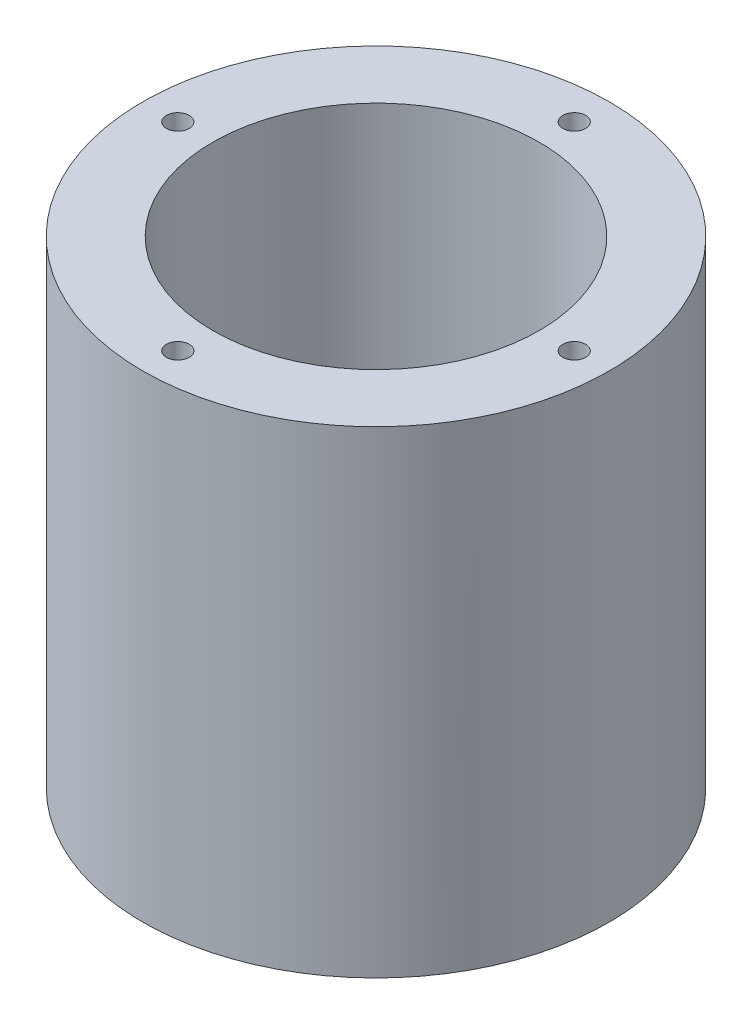
ISO-10303-21;
HEADER;
FILE_DESCRIPTION(('STEP AP214'),'2;1');
FILE_NAME('part.step','',(''),(''),'','','');
FILE_SCHEMA(('AUTOMOTIVE_DESIGN { 1 0 10303 214 1 1 1 1 }'));
ENDSEC;
DATA;
#1=APPLICATION_CONTEXT('core data for automotive mechanical design processes');
#2=APPLICATION_PROTOCOL_DEFINITION('international standard','automotive_design',2000,#1);
#3=PRODUCT_CONTEXT('',#1,'mechanical');
#4=PRODUCT('Part','Part','',(#3));
#5=PRODUCT_RELATED_PRODUCT_CATEGORY('part','',(#4));
#6=PRODUCT_DEFINITION_FORMATION('','',#4);
#7=PRODUCT_DEFINITION_CONTEXT('part definition',#1,'design');
#8=PRODUCT_DEFINITION('design','',#6,#7);
#9=PRODUCT_DEFINITION_SHAPE('','',#8);
#10=(LENGTH_UNIT() NAMED_UNIT(*) SI_UNIT(.MILLI.,.METRE.));
#11=(NAMED_UNIT(*) PLANE_ANGLE_UNIT() SI_UNIT($,.RADIAN.));
#12=(NAMED_UNIT(*) SI_UNIT($,.STERADIAN.) SOLID_ANGLE_UNIT());
#13=UNCERTAINTY_MEASURE_WITH_UNIT(LENGTH_MEASURE(1.E-05),#10,'distance_accuracy_value','');
#14=(GEOMETRIC_REPRESENTATION_CONTEXT(3) GLOBAL_UNCERTAINTY_ASSIGNED_CONTEXT((#13)) GLOBAL_UNIT_ASSIGNED_CONTEXT((#10,
#11,#12)) REPRESENTATION_CONTEXT('',''));
#15=CARTESIAN_POINT('',(0.,0.,0.));
#16=DIRECTION('',(0.,0.,1.));
#17=DIRECTION('',(1.,0.,0.));
#18=AXIS2_PLACEMENT_3D('',#15,#16,#17);
#19=CARTESIAN_POINT('',(0.,55.,0.));
#20=DIRECTION('',(0.,1.,0.));
#21=DIRECTION('',(0.,0.,1.));
#22=AXIS2_PLACEMENT_3D('',#19,#20,#21);
#23=PLANE('',#22);
#24=CARTESIAN_POINT('',(-26.9874999999992,55.,7.67030883253028E-13));
#25=DIRECTION('',(0.,1.,0.));
#26=DIRECTION('',(0.,0.,1.));
#27=AXIS2_PLACEMENT_3D('',#24,#25,#26);
#28=CIRCLE('',#27,1.55000000000123);
#29=CARTESIAN_POINT('',(-26.9874999999992,55.,1.55000000000199));
#30=VERTEX_POINT('',#29);
#31=EDGE_CURVE('E70',#30,#30,#28,.T.);
#32=ORIENTED_EDGE('',*,*,#31,.F.);
#33=EDGE_LOOP('',(#32));
#34=FACE_BOUND('',#33,.T.);
#35=CARTESIAN_POINT('',(1.52745173540766E-12,55.,26.9875));
#36=DIRECTION('',(0.,1.,0.));
#37=DIRECTION('',(0.,0.,1.));
#38=AXIS2_PLACEMENT_3D('',#35,#36,#37);
#39=CIRCLE('',#38,1.55000000000164);
#40=CARTESIAN_POINT('',(1.52745173540766E-12,55.,28.5375000000016));
#41=VERTEX_POINT('',#40);
#42=EDGE_CURVE('E64',#41,#41,#39,.T.);
#43=ORIENTED_EDGE('',*,*,#42,.F.);
#44=EDGE_LOOP('',(#43));
#45=FACE_BOUND('',#44,.T.);
#46=CARTESIAN_POINT('',(26.9875000000008,55.,-7.63725867703829E-13));
#47=DIRECTION('',(0.,1.,0.));
#48=DIRECTION('',(0.,0.,1.));
#49=AXIS2_PLACEMENT_3D('',#46,#47,#48);
#50=CIRCLE('',#49,1.5500000000006);
#51=CARTESIAN_POINT('',(26.9875000000008,55.,1.54999999999983));
#52=VERTEX_POINT('',#51);
#53=EDGE_CURVE('E58',#52,#52,#50,.T.);
#54=ORIENTED_EDGE('',*,*,#53,.F.);
#55=EDGE_LOOP('',(#54));
#56=FACE_BOUND('',#55,.T.);
#57=CARTESIAN_POINT('',(0.,55.,-26.9875));
#58=DIRECTION('',(0.,1.,0.));
#59=DIRECTION('',(0.,0.,1.));
#60=AXIS2_PLACEMENT_3D('',#57,#58,#59);
#61=CIRCLE('',#60,1.55);
#62=CARTESIAN_POINT('',(0.,55.,-25.4375));
#63=VERTEX_POINT('',#62);
#64=EDGE_CURVE('E52',#63,#63,#61,.T.);
#65=ORIENTED_EDGE('',*,*,#64,.F.);
#66=EDGE_LOOP('',(#65));
#67=FACE_BOUND('',#66,.T.);
#68=CARTESIAN_POINT('',(0.,55.,0.));
#69=DIRECTION('',(0.,1.,0.));
#70=DIRECTION('',(0.,0.,1.));
#71=AXIS2_PLACEMENT_3D('',#68,#69,#70);
#72=CIRCLE('',#71,31.75);
#73=CARTESIAN_POINT('',(0.,55.,31.75));
#74=VERTEX_POINT('',#73);
#75=EDGE_CURVE('E10',#74,#74,#72,.T.);
#76=ORIENTED_EDGE('',*,*,#75,.T.);
#77=EDGE_LOOP('',(#76));
#78=FACE_BOUND('',#77,.T.);
#79=CARTESIAN_POINT('',(0.,55.,0.));
#80=DIRECTION('',(0.,1.,0.));
#81=DIRECTION('',(0.,0.,1.));
#82=AXIS2_PLACEMENT_3D('',#79,#80,#81);
#83=CIRCLE('',#82,22.225);
#84=CARTESIAN_POINT('',(0.,55.,22.225));
#85=VERTEX_POINT('',#84);
#86=EDGE_CURVE('E38',#85,#85,#83,.T.);
#87=ORIENTED_EDGE('',*,*,#86,.F.);
#88=EDGE_LOOP('',(#87));
#89=FACE_BOUND('',#88,.T.);
#90=ADVANCED_FACE('F31',(#34,#45,#56,#67,#78,#89),#23,.T.);
#91=CARTESIAN_POINT('',(0.,55.,0.));
#92=DIRECTION('',(0.,-1.,0.));
#93=DIRECTION('',(0.,0.,-1.));
#94=AXIS2_PLACEMENT_3D('',#91,#92,#93);
#95=CYLINDRICAL_SURFACE('',#94,31.75);
#96=ORIENTED_EDGE('',*,*,#75,.F.);
#97=EDGE_LOOP('',(#96));
#98=FACE_BOUND('',#97,.T.);
#99=CARTESIAN_POINT('',(0.,-10.,0.));
#100=DIRECTION('',(0.,-1.,0.));
#101=DIRECTION('',(0.,0.,-1.));
#102=AXIS2_PLACEMENT_3D('',#99,#100,#101);
#103=CIRCLE('',#102,31.75);
#104=CARTESIAN_POINT('',(0.,-10.,-31.75));
#105=VERTEX_POINT('',#104);
#106=EDGE_CURVE('E47',#105,#105,#103,.T.);
#107=ORIENTED_EDGE('',*,*,#106,.F.);
#108=EDGE_LOOP('',(#107));
#109=FACE_BOUND('',#108,.T.);
#110=ADVANCED_FACE('F33',(#98,#109),#95,.T.);
#111=CARTESIAN_POINT('',(0.,55.,0.));
#112=DIRECTION('',(0.,-1.,0.));
#113=DIRECTION('',(0.,0.,-1.));
#114=AXIS2_PLACEMENT_3D('',#111,#112,#113);
#115=CYLINDRICAL_SURFACE('',#114,22.225);
#116=ORIENTED_EDGE('',*,*,#86,.T.);
#117=EDGE_LOOP('',(#116));
#118=FACE_BOUND('',#117,.T.);
#119=CARTESIAN_POINT('',(0.,0.,0.));
#120=DIRECTION('',(0.,1.,0.));
#121=DIRECTION('',(0.,0.,1.));
#122=AXIS2_PLACEMENT_3D('',#119,#120,#121);
#123=CIRCLE('',#122,22.225);
#124=CARTESIAN_POINT('',(0.,0.,22.225));
#125=VERTEX_POINT('',#124);
#126=EDGE_CURVE('E42',#125,#125,#123,.T.);
#127=ORIENTED_EDGE('',*,*,#126,.F.);
#128=EDGE_LOOP('',(#127));
#129=FACE_BOUND('',#128,.T.);
#130=ADVANCED_FACE('F108',(#118,#129),#115,.F.);
#131=CARTESIAN_POINT('',(0.,0.,0.));
#132=DIRECTION('',(0.,-1.,0.));
#133=DIRECTION('',(0.,0.,-1.));
#134=AXIS2_PLACEMENT_3D('',#131,#132,#133);
#135=PLANE('',#134);
#136=CARTESIAN_POINT('',(19.05,0.,2.66050878019847E-13));
#137=DIRECTION('',(0.,-1.,0.));
#138=DIRECTION('',(0.,0.,-1.));
#139=AXIS2_PLACEMENT_3D('',#136,#137,#138);
#140=CIRCLE('',#139,3.);
#141=CARTESIAN_POINT('',(19.05,0.,-2.99999999999974));
#142=VERTEX_POINT('',#141);
#143=EDGE_CURVE('E79',#142,#142,#140,.T.);
#144=ORIENTED_EDGE('',*,*,#143,.T.);
#145=EDGE_LOOP('',(#144));
#146=FACE_BOUND('',#145,.T.);
#147=CARTESIAN_POINT('',(-19.05,0.,0.));
#148=DIRECTION('',(0.,-1.,0.));
#149=DIRECTION('',(0.,0.,-1.));
#150=AXIS2_PLACEMENT_3D('',#147,#148,#149);
#151=CIRCLE('',#150,3.);
#152=CARTESIAN_POINT('',(-19.05,0.,-3.));
#153=VERTEX_POINT('',#152);
#154=EDGE_CURVE('E73',#153,#153,#151,.T.);
#155=ORIENTED_EDGE('',*,*,#154,.T.);
#156=EDGE_LOOP('',(#155));
#157=FACE_BOUND('',#156,.T.);
#158=ORIENTED_EDGE('',*,*,#126,.T.);
#159=EDGE_LOOP('',(#158));
#160=FACE_BOUND('',#159,.T.);
#161=ADVANCED_FACE('F88',(#146,#157,#160),#135,.F.);
#162=CARTESIAN_POINT('',(0.,-10.,0.));
#163=DIRECTION('',(0.,-1.,0.));
#164=DIRECTION('',(0.,0.,-1.));
#165=AXIS2_PLACEMENT_3D('',#162,#163,#164);
#166=PLANE('',#165);
#167=CARTESIAN_POINT('',(19.05,-10.,2.66050878019847E-13));
#168=DIRECTION('',(0.,-1.,0.));
#169=DIRECTION('',(0.,0.,-1.));
#170=AXIS2_PLACEMENT_3D('',#167,#168,#169);
#171=CIRCLE('',#170,3.);
#172=CARTESIAN_POINT('',(19.05,-10.,-2.99999999999974));
#173=VERTEX_POINT('',#172);
#174=EDGE_CURVE('E82',#173,#173,#171,.T.);
#175=ORIENTED_EDGE('',*,*,#174,.F.);
#176=EDGE_LOOP('',(#175));
#177=FACE_BOUND('',#176,.T.);
#178=CARTESIAN_POINT('',(-19.05,-10.,0.));
#179=DIRECTION('',(0.,-1.,0.));
#180=DIRECTION('',(0.,0.,-1.));
#181=AXIS2_PLACEMENT_3D('',#178,#179,#180);
#182=CIRCLE('',#181,3.);
#183=CARTESIAN_POINT('',(-19.05,-10.,-3.));
#184=VERTEX_POINT('',#183);
#185=EDGE_CURVE('E76',#184,#184,#182,.T.);
#186=ORIENTED_EDGE('',*,*,#185,.F.);
#187=EDGE_LOOP('',(#186));
#188=FACE_BOUND('',#187,.T.);
#189=ORIENTED_EDGE('',*,*,#106,.T.);
#190=EDGE_LOOP('',(#189));
#191=FACE_BOUND('',#190,.T.);
#192=ADVANCED_FACE('F98',(#177,#188,#191),#166,.T.);
#193=CARTESIAN_POINT('',(0.,50.,-26.9875));
#194=DIRECTION('',(0.,1.,0.));
#195=DIRECTION('',(0.,0.,1.));
#196=AXIS2_PLACEMENT_3D('',#193,#194,#195);
#197=CYLINDRICAL_SURFACE('',#196,1.55);
#198=CARTESIAN_POINT('',(0.,50.,-26.9875));
#199=DIRECTION('',(0.,1.,0.));
#200=DIRECTION('',(0.,0.,1.));
#201=AXIS2_PLACEMENT_3D('',#198,#199,#200);
#202=CIRCLE('',#201,1.55);
#203=CARTESIAN_POINT('',(0.,50.,-25.4375));
#204=VERTEX_POINT('',#203);
#205=EDGE_CURVE('E51',#204,#204,#202,.T.);
#206=ORIENTED_EDGE('',*,*,#205,.F.);
#207=EDGE_LOOP('',(#206));
#208=FACE_BOUND('',#207,.T.);
#209=ORIENTED_EDGE('',*,*,#64,.T.);
#210=EDGE_LOOP('',(#209));
#211=FACE_BOUND('',#210,.T.);
#212=ADVANCED_FACE('F101',(#208,#211),#197,.F.);
#213=CARTESIAN_POINT('',(0.,50.,-26.9875));
#214=DIRECTION('',(0.,1.,0.));
#215=DIRECTION('',(0.,0.,1.));
#216=AXIS2_PLACEMENT_3D('',#213,#214,#215);
#217=PLANE('',#216);
#218=ORIENTED_EDGE('',*,*,#205,.T.);
#219=EDGE_LOOP('',(#218));
#220=FACE_BOUND('',#219,.T.);
#221=ADVANCED_FACE('F125',(#220),#217,.T.);
#222=CARTESIAN_POINT('',(26.9875000000008,50.,-7.63725867703829E-13));
#223=DIRECTION('',(0.,1.,0.));
#224=DIRECTION('',(0.,0.,1.));
#225=AXIS2_PLACEMENT_3D('',#222,#223,#224);
#226=CYLINDRICAL_SURFACE('',#225,1.5500000000006);
#227=CARTESIAN_POINT('',(26.9875000000008,50.,-7.63725867703829E-13));
#228=DIRECTION('',(0.,1.,0.));
#229=DIRECTION('',(0.,0.,1.));
#230=AXIS2_PLACEMENT_3D('',#227,#228,#229);
#231=CIRCLE('',#230,1.5500000000006);
#232=CARTESIAN_POINT('',(26.9875000000008,50.,1.54999999999983));
#233=VERTEX_POINT('',#232);
#234=EDGE_CURVE('E55',#233,#233,#231,.T.);
#235=ORIENTED_EDGE('',*,*,#234,.F.);
#236=EDGE_LOOP('',(#235));
#237=FACE_BOUND('',#236,.T.);
#238=ORIENTED_EDGE('',*,*,#53,.T.);
#239=EDGE_LOOP('',(#238));
#240=FACE_BOUND('',#239,.T.);
#241=ADVANCED_FACE('F129',(#237,#240),#226,.F.);
#242=CARTESIAN_POINT('',(26.9875000000008,50.,-7.63725867703829E-13));
#243=DIRECTION('',(0.,1.,0.));
#244=DIRECTION('',(0.,0.,1.));
#245=AXIS2_PLACEMENT_3D('',#242,#243,#244);
#246=PLANE('',#245);
#247=ORIENTED_EDGE('',*,*,#234,.T.);
#248=EDGE_LOOP('',(#247));
#249=FACE_BOUND('',#248,.T.);
#250=ADVANCED_FACE('F133',(#249),#246,.T.);
#251=CARTESIAN_POINT('',(1.52745173540766E-12,50.,26.9875));
#252=DIRECTION('',(0.,1.,0.));
#253=DIRECTION('',(0.,0.,1.));
#254=AXIS2_PLACEMENT_3D('',#251,#252,#253);
#255=CYLINDRICAL_SURFACE('',#254,1.55000000000164);
#256=CARTESIAN_POINT('',(1.52745173540766E-12,50.,26.9875));
#257=DIRECTION('',(0.,1.,0.));
#258=DIRECTION('',(0.,0.,1.));
#259=AXIS2_PLACEMENT_3D('',#256,#257,#258);
#260=CIRCLE('',#259,1.55000000000164);
#261=CARTESIAN_POINT('',(1.52745173540766E-12,50.,28.5375000000016));
#262=VERTEX_POINT('',#261);
#263=EDGE_CURVE('E61',#262,#262,#260,.T.);
#264=ORIENTED_EDGE('',*,*,#263,.F.);
#265=EDGE_LOOP('',(#264));
#266=FACE_BOUND('',#265,.T.);
#267=ORIENTED_EDGE('',*,*,#42,.T.);
#268=EDGE_LOOP('',(#267));
#269=FACE_BOUND('',#268,.T.);
#270=ADVANCED_FACE('F137',(#266,#269),#255,.F.);
#271=CARTESIAN_POINT('',(1.52745173540766E-12,50.,26.9875));
#272=DIRECTION('',(0.,1.,0.));
#273=DIRECTION('',(0.,0.,1.));
#274=AXIS2_PLACEMENT_3D('',#271,#272,#273);
#275=PLANE('',#274);
#276=ORIENTED_EDGE('',*,*,#263,.T.);
#277=EDGE_LOOP('',(#276));
#278=FACE_BOUND('',#277,.T.);
#279=ADVANCED_FACE('F141',(#278),#275,.T.);
#280=CARTESIAN_POINT('',(-26.9874999999992,50.,7.67030883253028E-13));
#281=DIRECTION('',(0.,1.,0.));
#282=DIRECTION('',(0.,0.,1.));
#283=AXIS2_PLACEMENT_3D('',#280,#281,#282);
#284=CYLINDRICAL_SURFACE('',#283,1.55000000000123);
#285=CARTESIAN_POINT('',(-26.9874999999992,50.,7.67030883253028E-13));
#286=DIRECTION('',(0.,1.,0.));
#287=DIRECTION('',(0.,0.,1.));
#288=AXIS2_PLACEMENT_3D('',#285,#286,#287);
#289=CIRCLE('',#288,1.55000000000123);
#290=CARTESIAN_POINT('',(-26.9874999999992,50.,1.55000000000199));
#291=VERTEX_POINT('',#290);
#292=EDGE_CURVE('E67',#291,#291,#289,.T.);
#293=ORIENTED_EDGE('',*,*,#292,.F.);
#294=EDGE_LOOP('',(#293));
#295=FACE_BOUND('',#294,.T.);
#296=ORIENTED_EDGE('',*,*,#31,.T.);
#297=EDGE_LOOP('',(#296));
#298=FACE_BOUND('',#297,.T.);
#299=ADVANCED_FACE('F145',(#295,#298),#284,.F.);
#300=CARTESIAN_POINT('',(-26.9874999999992,50.,7.67030883253028E-13));
#301=DIRECTION('',(0.,1.,0.));
#302=DIRECTION('',(0.,0.,1.));
#303=AXIS2_PLACEMENT_3D('',#300,#301,#302);
#304=PLANE('',#303);
#305=ORIENTED_EDGE('',*,*,#292,.T.);
#306=EDGE_LOOP('',(#305));
#307=FACE_BOUND('',#306,.T.);
#308=ADVANCED_FACE('F149',(#307),#304,.T.);
#309=CARTESIAN_POINT('',(-19.05,0.,0.));
#310=DIRECTION('',(0.,-1.,0.));
#311=DIRECTION('',(0.,0.,-1.));
#312=AXIS2_PLACEMENT_3D('',#309,#310,#311);
#313=CYLINDRICAL_SURFACE('',#312,3.);
#314=ORIENTED_EDGE('',*,*,#154,.F.);
#315=EDGE_LOOP('',(#314));
#316=FACE_BOUND('',#315,.T.);
#317=ORIENTED_EDGE('',*,*,#185,.T.);
#318=EDGE_LOOP('',(#317));
#319=FACE_BOUND('',#318,.T.);
#320=ADVANCED_FACE('F94',(#316,#319),#313,.F.);
#321=CARTESIAN_POINT('',(19.05,0.,2.66050878019847E-13));
#322=DIRECTION('',(0.,-1.,0.));
#323=DIRECTION('',(0.,0.,-1.));
#324=AXIS2_PLACEMENT_3D('',#321,#322,#323);
#325=CYLINDRICAL_SURFACE('',#324,3.);
#326=ORIENTED_EDGE('',*,*,#143,.F.);
#327=EDGE_LOOP('',(#326));
#328=FACE_BOUND('',#327,.T.);
#329=ORIENTED_EDGE('',*,*,#174,.T.);
#330=EDGE_LOOP('',(#329));
#331=FACE_BOUND('',#330,.T.);
#332=ADVANCED_FACE('F91',(#328,#331),#325,.F.);
#333=CLOSED_SHELL('',(#90,#110,#130,#161,#192,#212,#221,#241,#250,#270,#279,#299,#308,#320,#332));
#334=MANIFOLD_SOLID_BREP('B2',#333);
#335=ADVANCED_BREP_SHAPE_REPRESENTATION('',(#18,#334),#14);
#336=SHAPE_DEFINITION_REPRESENTATION(#9,#335);
ENDSEC;
END-ISO-10303-21;
